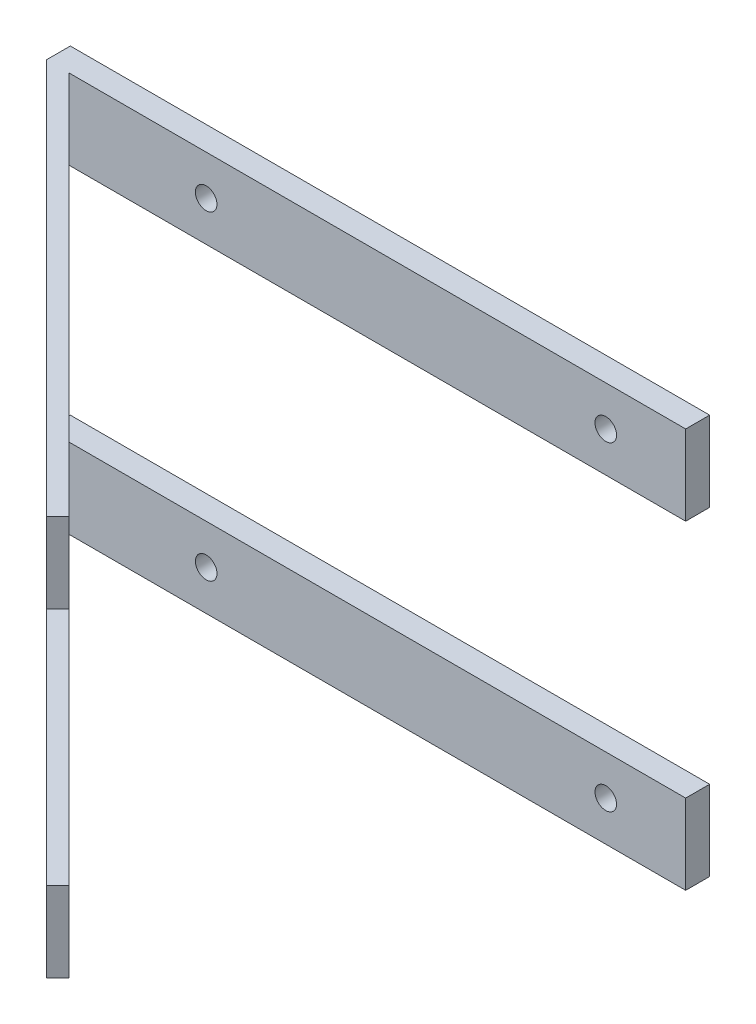
ISO-10303-21;
HEADER;
FILE_DESCRIPTION(('STEP AP214'),'2;1');
FILE_NAME('part.step','',(''),(''),'','','');
FILE_SCHEMA(('AUTOMOTIVE_DESIGN { 1 0 10303 214 1 1 1 1 }'));
ENDSEC;
DATA;
#1=APPLICATION_CONTEXT('core data for automotive mechanical design processes');
#2=APPLICATION_PROTOCOL_DEFINITION('international standard','automotive_design',2000,#1);
#3=PRODUCT_CONTEXT('',#1,'mechanical');
#4=PRODUCT('Part','Part','',(#3));
#5=PRODUCT_RELATED_PRODUCT_CATEGORY('part','',(#4));
#6=PRODUCT_DEFINITION_FORMATION('','',#4);
#7=PRODUCT_DEFINITION_CONTEXT('part definition',#1,'design');
#8=PRODUCT_DEFINITION('design','',#6,#7);
#9=PRODUCT_DEFINITION_SHAPE('','',#8);
#10=(LENGTH_UNIT() NAMED_UNIT(*) SI_UNIT(.MILLI.,.METRE.));
#11=(NAMED_UNIT(*) PLANE_ANGLE_UNIT() SI_UNIT($,.RADIAN.));
#12=(NAMED_UNIT(*) SI_UNIT($,.STERADIAN.) SOLID_ANGLE_UNIT());
#13=UNCERTAINTY_MEASURE_WITH_UNIT(LENGTH_MEASURE(1.E-05),#10,'distance_accuracy_value','');
#14=(GEOMETRIC_REPRESENTATION_CONTEXT(3) GLOBAL_UNCERTAINTY_ASSIGNED_CONTEXT((#13)) GLOBAL_UNIT_ASSIGNED_CONTEXT((#10,
#11,#12)) REPRESENTATION_CONTEXT('',''));
#15=CARTESIAN_POINT('',(0.,0.,0.));
#16=DIRECTION('',(0.,0.,1.));
#17=DIRECTION('',(1.,0.,0.));
#18=AXIS2_PLACEMENT_3D('',#15,#16,#17);
#19=CARTESIAN_POINT('',(0.,0.,3.));
#20=DIRECTION('',(0.,0.,1.));
#21=DIRECTION('',(1.,0.,0.));
#22=AXIS2_PLACEMENT_3D('',#19,#20,#21);
#23=PLANE('',#22);
#24=CARTESIAN_POINT('',(30.,4.99999999999999,3.));
#25=DIRECTION('',(0.,0.,1.));
#26=DIRECTION('',(1.,0.,0.));
#27=AXIS2_PLACEMENT_3D('',#24,#25,#26);
#28=CIRCLE('',#27,1.35);
#29=CARTESIAN_POINT('',(31.35,4.99999999999999,3.));
#30=VERTEX_POINT('',#29);
#31=EDGE_CURVE('E218',#30,#30,#28,.T.);
#32=ORIENTED_EDGE('',*,*,#31,.F.);
#33=EDGE_LOOP('',(#32));
#34=FACE_BOUND('',#33,.T.);
#35=CARTESIAN_POINT('',(-20.,4.99999999999999,3.));
#36=DIRECTION('',(0.,0.,1.));
#37=DIRECTION('',(1.,0.,0.));
#38=AXIS2_PLACEMENT_3D('',#35,#36,#37);
#39=CIRCLE('',#38,1.35);
#40=CARTESIAN_POINT('',(-18.65,4.99999999999999,3.));
#41=VERTEX_POINT('',#40);
#42=EDGE_CURVE('E174',#41,#41,#39,.T.);
#43=ORIENTED_EDGE('',*,*,#42,.F.);
#44=EDGE_LOOP('',(#43));
#45=FACE_BOUND('',#44,.T.);
#46=DIRECTION('',(1.,0.,0.));
#47=VECTOR('',#46,1.);
#48=CARTESIAN_POINT('',(-40.,10.,3.));
#49=LINE('',#48,#47);
#50=CARTESIAN_POINT('',(-37.1715728752538,9.99999999999999,3.));
#51=VERTEX_POINT('',#50);
#52=CARTESIAN_POINT('',(40.,10.,3.));
#53=VERTEX_POINT('',#52);
#54=EDGE_CURVE('E155',#51,#53,#49,.T.);
#55=ORIENTED_EDGE('',*,*,#54,.F.);
#56=DIRECTION('',(0.,-1.,0.));
#57=VECTOR('',#56,1.);
#58=CARTESIAN_POINT('',(-37.1715728752538,81.0070419043069,3.));
#59=LINE('',#58,#57);
#60=CARTESIAN_POINT('',(-37.1715728752538,0.,3.));
#61=VERTEX_POINT('',#60);
#62=EDGE_CURVE('E135',#51,#61,#59,.T.);
#63=ORIENTED_EDGE('',*,*,#62,.T.);
#64=DIRECTION('',(1.,0.,0.));
#65=VECTOR('',#64,1.);
#66=CARTESIAN_POINT('',(-40.,0.,3.));
#67=LINE('',#66,#65);
#68=CARTESIAN_POINT('',(40.,0.,3.));
#69=VERTEX_POINT('',#68);
#70=EDGE_CURVE('E87',#61,#69,#67,.T.);
#71=ORIENTED_EDGE('',*,*,#70,.T.);
#72=DIRECTION('',(0.,-1.,0.));
#73=VECTOR('',#72,1.);
#74=CARTESIAN_POINT('',(40.,10.,3.));
#75=LINE('',#74,#73);
#76=EDGE_CURVE('E165',#53,#69,#75,.T.);
#77=ORIENTED_EDGE('',*,*,#76,.F.);
#78=EDGE_LOOP('',(#55,#63,#71,#77));
#79=FACE_BOUND('',#78,.T.);
#80=ADVANCED_FACE('F47',(#34,#45,#79),#23,.T.);
#81=CARTESIAN_POINT('',(-40.,10.,3.));
#82=DIRECTION('',(1.,0.,0.));
#83=DIRECTION('',(0.,0.,-1.));
#84=AXIS2_PLACEMENT_3D('',#81,#82,#83);
#85=PLANE('',#84);
#86=DIRECTION('',(0.,-1.,0.));
#87=VECTOR('',#86,1.);
#88=CARTESIAN_POINT('',(-40.,10.,0.));
#89=LINE('',#88,#87);
#90=CARTESIAN_POINT('',(-40.,10.,0.));
#91=VERTEX_POINT('',#90);
#92=CARTESIAN_POINT('',(-40.,0.,0.));
#93=VERTEX_POINT('',#92);
#94=EDGE_CURVE('E12',#91,#93,#89,.T.);
#95=ORIENTED_EDGE('',*,*,#94,.T.);
#96=DIRECTION('',(0.,0.,-1.));
#97=VECTOR('',#96,1.);
#98=CARTESIAN_POINT('',(-40.,0.,3.));
#99=LINE('',#98,#97);
#100=CARTESIAN_POINT('',(-40.,0.,3.));
#101=VERTEX_POINT('',#100);
#102=EDGE_CURVE('E143',#101,#93,#99,.T.);
#103=ORIENTED_EDGE('',*,*,#102,.F.);
#104=DIRECTION('',(0.,-1.,0.));
#105=VECTOR('',#104,1.);
#106=CARTESIAN_POINT('',(-40.,10.,3.));
#107=LINE('',#106,#105);
#108=CARTESIAN_POINT('',(-40.,9.99999999999999,3.));
#109=VERTEX_POINT('',#108);
#110=EDGE_CURVE('E160',#109,#101,#107,.T.);
#111=ORIENTED_EDGE('',*,*,#110,.F.);
#112=DIRECTION('',(0.,0.,-1.));
#113=VECTOR('',#112,1.);
#114=CARTESIAN_POINT('',(-40.,10.,3.));
#115=LINE('',#114,#113);
#116=EDGE_CURVE('E94',#109,#91,#115,.T.);
#117=ORIENTED_EDGE('',*,*,#116,.T.);
#118=EDGE_LOOP('',(#95,#103,#111,#117));
#119=FACE_BOUND('',#118,.T.);
#120=ADVANCED_FACE('F195',(#119),#85,.F.);
#121=CARTESIAN_POINT('',(-40.,0.,3.));
#122=DIRECTION('',(0.,1.,0.));
#123=DIRECTION('',(0.,0.,1.));
#124=AXIS2_PLACEMENT_3D('',#121,#122,#123);
#125=PLANE('',#124);
#126=DIRECTION('',(1.,0.,0.));
#127=VECTOR('',#126,1.);
#128=CARTESIAN_POINT('',(-40.,0.,0.));
#129=LINE('',#128,#127);
#130=CARTESIAN_POINT('',(40.,0.,0.));
#131=VERTEX_POINT('',#130);
#132=EDGE_CURVE('E55',#93,#131,#129,.T.);
#133=ORIENTED_EDGE('',*,*,#132,.T.);
#134=DIRECTION('',(0.,0.,-1.));
#135=VECTOR('',#134,1.);
#136=CARTESIAN_POINT('',(40.,0.,3.));
#137=LINE('',#136,#135);
#138=EDGE_CURVE('E150',#69,#131,#137,.T.);
#139=ORIENTED_EDGE('',*,*,#138,.F.);
#140=ORIENTED_EDGE('',*,*,#70,.F.);
#141=DIRECTION('',(0.707106781186551,0.,0.707106781186544));
#142=VECTOR('',#141,1.);
#143=CARTESIAN_POINT('',(10.9116882454317,0.,51.083261120685));
#144=LINE('',#143,#142);
#145=CARTESIAN_POINT('',(10.9116882454317,0.,51.083261120685));
#146=VERTEX_POINT('',#145);
#147=EDGE_CURVE('E63',#61,#146,#144,.T.);
#148=ORIENTED_EDGE('',*,*,#147,.T.);
#149=DIRECTION('',(-0.707106781186542,0.,0.707106781186553));
#150=VECTOR('',#149,1.);
#151=CARTESIAN_POINT('',(9.49747468305858,0.,52.4974746830581));
#152=LINE('',#151,#150);
#153=CARTESIAN_POINT('',(9.49747468305858,0.,52.4974746830581));
#154=VERTEX_POINT('',#153);
#155=EDGE_CURVE('E132',#146,#154,#152,.T.);
#156=ORIENTED_EDGE('',*,*,#155,.T.);
#157=DIRECTION('',(-0.707106781186551,0.,-0.707106781186544));
#158=VECTOR('',#157,1.);
#159=CARTESIAN_POINT('',(-40.,0.,3.));
#160=LINE('',#159,#158);
#161=EDGE_CURVE('E137',#154,#101,#160,.T.);
#162=ORIENTED_EDGE('',*,*,#161,.T.);
#163=ORIENTED_EDGE('',*,*,#102,.T.);
#164=EDGE_LOOP('',(#133,#139,#140,#148,#156,#162,#163));
#165=FACE_BOUND('',#164,.T.);
#166=ADVANCED_FACE('F185',(#165),#125,.F.);
#167=CARTESIAN_POINT('',(40.,10.,3.));
#168=DIRECTION('',(1.,0.,0.));
#169=DIRECTION('',(0.,0.,-1.));
#170=AXIS2_PLACEMENT_3D('',#167,#168,#169);
#171=PLANE('',#170);
#172=DIRECTION('',(0.,-1.,0.));
#173=VECTOR('',#172,1.);
#174=CARTESIAN_POINT('',(40.,10.,0.));
#175=LINE('',#174,#173);
#176=CARTESIAN_POINT('',(40.,10.,0.));
#177=VERTEX_POINT('',#176);
#178=EDGE_CURVE('E159',#177,#131,#175,.T.);
#179=ORIENTED_EDGE('',*,*,#178,.F.);
#180=DIRECTION('',(0.,0.,-1.));
#181=VECTOR('',#180,1.);
#182=CARTESIAN_POINT('',(40.,10.,3.));
#183=LINE('',#182,#181);
#184=EDGE_CURVE('E152',#53,#177,#183,.T.);
#185=ORIENTED_EDGE('',*,*,#184,.F.);
#186=ORIENTED_EDGE('',*,*,#76,.T.);
#187=ORIENTED_EDGE('',*,*,#138,.T.);
#188=EDGE_LOOP('',(#179,#185,#186,#187));
#189=FACE_BOUND('',#188,.T.);
#190=ADVANCED_FACE('F193',(#189),#171,.T.);
#191=CARTESIAN_POINT('',(-40.,10.,3.));
#192=DIRECTION('',(0.,1.,0.));
#193=DIRECTION('',(0.,0.,1.));
#194=AXIS2_PLACEMENT_3D('',#191,#192,#193);
#195=PLANE('',#194);
#196=DIRECTION('',(1.,0.,0.));
#197=VECTOR('',#196,1.);
#198=CARTESIAN_POINT('',(-40.,10.,0.));
#199=LINE('',#198,#197);
#200=EDGE_CURVE('E156',#91,#177,#199,.T.);
#201=ORIENTED_EDGE('',*,*,#200,.F.);
#202=ORIENTED_EDGE('',*,*,#116,.F.);
#203=DIRECTION('',(-0.707106781186551,0.,-0.707106781186544));
#204=VECTOR('',#203,1.);
#205=CARTESIAN_POINT('',(-40.,9.99999999999999,3.));
#206=LINE('',#205,#204);
#207=CARTESIAN_POINT('',(9.49747468305858,9.99999999999999,52.4974746830581));
#208=VERTEX_POINT('',#207);
#209=EDGE_CURVE('E123',#208,#109,#206,.T.);
#210=ORIENTED_EDGE('',*,*,#209,.F.);
#211=DIRECTION('',(-0.707106781186542,0.,0.707106781186553));
#212=VECTOR('',#211,1.);
#213=CARTESIAN_POINT('',(9.49747468305858,9.99999999999999,52.4974746830581));
#214=LINE('',#213,#212);
#215=CARTESIAN_POINT('',(10.9116882454317,9.99999999999999,51.083261120685));
#216=VERTEX_POINT('',#215);
#217=EDGE_CURVE('E117',#216,#208,#214,.T.);
#218=ORIENTED_EDGE('',*,*,#217,.F.);
#219=DIRECTION('',(0.707106781186551,0.,0.707106781186544));
#220=VECTOR('',#219,1.);
#221=CARTESIAN_POINT('',(10.9116882454317,9.99999999999999,51.083261120685));
#222=LINE('',#221,#220);
#223=EDGE_CURVE('E122',#51,#216,#222,.T.);
#224=ORIENTED_EDGE('',*,*,#223,.F.);
#225=ORIENTED_EDGE('',*,*,#54,.T.);
#226=ORIENTED_EDGE('',*,*,#184,.T.);
#227=EDGE_LOOP('',(#201,#202,#210,#218,#224,#225,#226));
#228=FACE_BOUND('',#227,.T.);
#229=ADVANCED_FACE('F120',(#228),#195,.T.);
#230=CARTESIAN_POINT('',(0.,0.,0.));
#231=DIRECTION('',(0.,0.,1.));
#232=DIRECTION('',(1.,0.,0.));
#233=AXIS2_PLACEMENT_3D('',#230,#231,#232);
#234=PLANE('',#233);
#235=CARTESIAN_POINT('',(30.,4.99999999999999,0.));
#236=DIRECTION('',(0.,0.,1.));
#237=DIRECTION('',(1.,0.,0.));
#238=AXIS2_PLACEMENT_3D('',#235,#236,#237);
#239=CIRCLE('',#238,1.35);
#240=CARTESIAN_POINT('',(31.35,4.99999999999999,0.));
#241=VERTEX_POINT('',#240);
#242=EDGE_CURVE('E179',#241,#241,#239,.T.);
#243=ORIENTED_EDGE('',*,*,#242,.T.);
#244=EDGE_LOOP('',(#243));
#245=FACE_BOUND('',#244,.T.);
#246=CARTESIAN_POINT('',(-20.,4.99999999999999,0.));
#247=DIRECTION('',(0.,0.,1.));
#248=DIRECTION('',(1.,0.,0.));
#249=AXIS2_PLACEMENT_3D('',#246,#247,#248);
#250=CIRCLE('',#249,1.35);
#251=CARTESIAN_POINT('',(-18.65,4.99999999999999,0.));
#252=VERTEX_POINT('',#251);
#253=EDGE_CURVE('E170',#252,#252,#250,.T.);
#254=ORIENTED_EDGE('',*,*,#253,.T.);
#255=EDGE_LOOP('',(#254));
#256=FACE_BOUND('',#255,.T.);
#257=ORIENTED_EDGE('',*,*,#94,.F.);
#258=ORIENTED_EDGE('',*,*,#200,.T.);
#259=ORIENTED_EDGE('',*,*,#178,.T.);
#260=ORIENTED_EDGE('',*,*,#132,.F.);
#261=EDGE_LOOP('',(#257,#258,#259,#260));
#262=FACE_BOUND('',#261,.T.);
#263=ADVANCED_FACE('F194',(#245,#256,#262),#234,.F.);
#264=CARTESIAN_POINT('',(10.9116882454317,81.0070419043069,51.083261120685));
#265=DIRECTION('',(0.707106781186544,0.,-0.707106781186551));
#266=DIRECTION('',(-0.707106781186551,0.,-0.707106781186544));
#267=AXIS2_PLACEMENT_3D('',#264,#265,#266);
#268=PLANE('',#267);
#269=ORIENTED_EDGE('',*,*,#62,.F.);
#270=ORIENTED_EDGE('',*,*,#223,.T.);
#271=DIRECTION('',(0.,-1.,0.));
#272=VECTOR('',#271,1.);
#273=CARTESIAN_POINT('',(10.9116882454317,81.0070419043069,51.083261120685));
#274=LINE('',#273,#272);
#275=EDGE_CURVE('E127',#216,#146,#274,.T.);
#276=ORIENTED_EDGE('',*,*,#275,.T.);
#277=ORIENTED_EDGE('',*,*,#147,.F.);
#278=EDGE_LOOP('',(#269,#270,#276,#277));
#279=FACE_BOUND('',#278,.T.);
#280=ADVANCED_FACE('F134',(#279),#268,.T.);
#281=CARTESIAN_POINT('',(9.49747468305858,81.0070419043069,52.4974746830581));
#282=DIRECTION('',(0.707106781186553,0.,0.707106781186542));
#283=DIRECTION('',(0.707106781186542,0.,-0.707106781186553));
#284=AXIS2_PLACEMENT_3D('',#281,#282,#283);
#285=PLANE('',#284);
#286=ORIENTED_EDGE('',*,*,#275,.F.);
#287=ORIENTED_EDGE('',*,*,#217,.T.);
#288=DIRECTION('',(0.,-1.,0.));
#289=VECTOR('',#288,1.);
#290=CARTESIAN_POINT('',(9.49747468305858,81.0070419043069,52.4974746830581));
#291=LINE('',#290,#289);
#292=EDGE_CURVE('E126',#208,#154,#291,.T.);
#293=ORIENTED_EDGE('',*,*,#292,.T.);
#294=ORIENTED_EDGE('',*,*,#155,.F.);
#295=EDGE_LOOP('',(#286,#287,#293,#294));
#296=FACE_BOUND('',#295,.T.);
#297=ADVANCED_FACE('F130',(#296),#285,.T.);
#298=CARTESIAN_POINT('',(-40.,81.0070419043069,3.));
#299=DIRECTION('',(-0.707106781186544,0.,0.707106781186551));
#300=DIRECTION('',(0.707106781186551,0.,0.707106781186544));
#301=AXIS2_PLACEMENT_3D('',#298,#299,#300);
#302=PLANE('',#301);
#303=ORIENTED_EDGE('',*,*,#292,.F.);
#304=ORIENTED_EDGE('',*,*,#209,.T.);
#305=ORIENTED_EDGE('',*,*,#110,.T.);
#306=ORIENTED_EDGE('',*,*,#161,.F.);
#307=EDGE_LOOP('',(#303,#304,#305,#306));
#308=FACE_BOUND('',#307,.T.);
#309=ADVANCED_FACE('F187',(#308),#302,.T.);
#310=CARTESIAN_POINT('',(-20.,4.99999999999999,3.));
#311=DIRECTION('',(0.,0.,1.));
#312=DIRECTION('',(1.,0.,0.));
#313=AXIS2_PLACEMENT_3D('',#310,#311,#312);
#314=CYLINDRICAL_SURFACE('',#313,1.35);
#315=ORIENTED_EDGE('',*,*,#253,.F.);
#316=EDGE_LOOP('',(#315));
#317=FACE_BOUND('',#316,.T.);
#318=ORIENTED_EDGE('',*,*,#42,.T.);
#319=EDGE_LOOP('',(#318));
#320=FACE_BOUND('',#319,.T.);
#321=ADVANCED_FACE('F227',(#317,#320),#314,.F.);
#322=CARTESIAN_POINT('',(30.,4.99999999999999,3.));
#323=DIRECTION('',(0.,0.,1.));
#324=DIRECTION('',(1.,0.,0.));
#325=AXIS2_PLACEMENT_3D('',#322,#323,#324);
#326=CYLINDRICAL_SURFACE('',#325,1.35);
#327=ORIENTED_EDGE('',*,*,#242,.F.);
#328=EDGE_LOOP('',(#327));
#329=FACE_BOUND('',#328,.T.);
#330=ORIENTED_EDGE('',*,*,#31,.T.);
#331=EDGE_LOOP('',(#330));
#332=FACE_BOUND('',#331,.T.);
#333=ADVANCED_FACE('F223',(#329,#332),#326,.F.);
#334=CLOSED_SHELL('',(#80,#120,#166,#190,#229,#263,#280,#297,#309,#321,#333));
#335=MANIFOLD_SOLID_BREP('B2',#334);
#336=CARTESIAN_POINT('',(-40.,0.,3.));
#337=DIRECTION('',(-1.,0.,0.));
#338=DIRECTION('',(0.,0.,1.));
#339=AXIS2_PLACEMENT_3D('',#336,#337,#338);
#340=PLANE('',#339);
#341=DIRECTION('',(0.,1.,0.));
#342=VECTOR('',#341,1.);
#343=CARTESIAN_POINT('',(-40.,0.,0.));
#344=LINE('',#343,#342);
#345=CARTESIAN_POINT('',(-40.,40.,0.));
#346=VERTEX_POINT('',#345);
#347=CARTESIAN_POINT('',(-40.,50.,0.));
#348=VERTEX_POINT('',#347);
#349=EDGE_CURVE('E412',#346,#348,#344,.T.);
#350=ORIENTED_EDGE('',*,*,#349,.F.);
#351=DIRECTION('',(0.,0.,-1.));
#352=VECTOR('',#351,1.);
#353=CARTESIAN_POINT('',(-40.,40.,3.));
#354=LINE('',#353,#352);
#355=CARTESIAN_POINT('',(-40.,40.,3.));
#356=VERTEX_POINT('',#355);
#357=EDGE_CURVE('E45',#356,#346,#354,.T.);
#358=ORIENTED_EDGE('',*,*,#357,.F.);
#359=DIRECTION('',(0.,1.,0.));
#360=VECTOR('',#359,1.);
#361=CARTESIAN_POINT('',(-40.,0.,3.));
#362=LINE('',#361,#360);
#363=CARTESIAN_POINT('',(-40.,50.,3.));
#364=VERTEX_POINT('',#363);
#365=EDGE_CURVE('E438',#356,#364,#362,.T.);
#366=ORIENTED_EDGE('',*,*,#365,.T.);
#367=DIRECTION('',(0.,0.,-1.));
#368=VECTOR('',#367,1.);
#369=CARTESIAN_POINT('',(-40.,50.,3.));
#370=LINE('',#369,#368);
#371=EDGE_CURVE('E332',#364,#348,#370,.T.);
#372=ORIENTED_EDGE('',*,*,#371,.T.);
#373=EDGE_LOOP('',(#350,#358,#366,#372));
#374=FACE_BOUND('',#373,.T.);
#375=ADVANCED_FACE('F307',(#374),#340,.T.);
#376=CARTESIAN_POINT('',(0.,40.,3.));
#377=DIRECTION('',(0.,1.,0.));
#378=DIRECTION('',(0.,0.,1.));
#379=AXIS2_PLACEMENT_3D('',#376,#377,#378);
#380=PLANE('',#379);
#381=DIRECTION('',(1.,0.,0.));
#382=VECTOR('',#381,1.);
#383=CARTESIAN_POINT('',(0.,40.,0.));
#384=LINE('',#383,#382);
#385=CARTESIAN_POINT('',(40.,40.,0.));
#386=VERTEX_POINT('',#385);
#387=EDGE_CURVE('E444',#346,#386,#384,.T.);
#388=ORIENTED_EDGE('',*,*,#387,.T.);
#389=DIRECTION('',(0.,0.,-1.));
#390=VECTOR('',#389,1.);
#391=CARTESIAN_POINT('',(40.,40.,3.));
#392=LINE('',#391,#390);
#393=CARTESIAN_POINT('',(40.,40.,3.));
#394=VERTEX_POINT('',#393);
#395=EDGE_CURVE('E315',#394,#386,#392,.T.);
#396=ORIENTED_EDGE('',*,*,#395,.F.);
#397=DIRECTION('',(1.,0.,0.));
#398=VECTOR('',#397,1.);
#399=CARTESIAN_POINT('',(0.,40.,3.));
#400=LINE('',#399,#398);
#401=CARTESIAN_POINT('',(-37.1715728752538,40.,3.));
#402=VERTEX_POINT('',#401);
#403=EDGE_CURVE('E424',#402,#394,#400,.T.);
#404=ORIENTED_EDGE('',*,*,#403,.F.);
#405=DIRECTION('',(0.707106781186551,0.,0.707106781186544));
#406=VECTOR('',#405,1.);
#407=CARTESIAN_POINT('',(10.9116882454317,40.,51.083261120685));
#408=LINE('',#407,#406);
#409=CARTESIAN_POINT('',(10.9116882454317,40.,51.083261120685));
#410=VERTEX_POINT('',#409);
#411=EDGE_CURVE('E409',#402,#410,#408,.T.);
#412=ORIENTED_EDGE('',*,*,#411,.T.);
#413=DIRECTION('',(-0.707106781186545,0.,0.707106781186551));
#414=VECTOR('',#413,1.);
#415=CARTESIAN_POINT('',(9.49747468305859,40.,52.4974746830581));
#416=LINE('',#415,#414);
#417=CARTESIAN_POINT('',(9.49747468305859,40.,52.4974746830581));
#418=VERTEX_POINT('',#417);
#419=EDGE_CURVE('E397',#410,#418,#416,.T.);
#420=ORIENTED_EDGE('',*,*,#419,.T.);
#421=DIRECTION('',(-0.707106781186551,0.,-0.707106781186544));
#422=VECTOR('',#421,1.);
#423=CARTESIAN_POINT('',(-40.,40.,3.));
#424=LINE('',#423,#422);
#425=EDGE_CURVE('E377',#418,#356,#424,.T.);
#426=ORIENTED_EDGE('',*,*,#425,.T.);
#427=ORIENTED_EDGE('',*,*,#357,.T.);
#428=EDGE_LOOP('',(#388,#396,#404,#412,#420,#426,#427));
#429=FACE_BOUND('',#428,.T.);
#430=ADVANCED_FACE('F414',(#429),#380,.F.);
#431=CARTESIAN_POINT('',(40.,0.,3.));
#432=DIRECTION('',(-1.,0.,0.));
#433=DIRECTION('',(0.,0.,1.));
#434=AXIS2_PLACEMENT_3D('',#431,#432,#433);
#435=PLANE('',#434);
#436=DIRECTION('',(0.,1.,0.));
#437=VECTOR('',#436,1.);
#438=CARTESIAN_POINT('',(40.,0.,0.));
#439=LINE('',#438,#437);
#440=CARTESIAN_POINT('',(40.,50.,0.));
#441=VERTEX_POINT('',#440);
#442=EDGE_CURVE('E431',#386,#441,#439,.T.);
#443=ORIENTED_EDGE('',*,*,#442,.T.);
#444=DIRECTION('',(0.,0.,-1.));
#445=VECTOR('',#444,1.);
#446=CARTESIAN_POINT('',(40.,50.,3.));
#447=LINE('',#446,#445);
#448=CARTESIAN_POINT('',(40.,50.,3.));
#449=VERTEX_POINT('',#448);
#450=EDGE_CURVE('E419',#449,#441,#447,.T.);
#451=ORIENTED_EDGE('',*,*,#450,.F.);
#452=DIRECTION('',(0.,1.,0.));
#453=VECTOR('',#452,1.);
#454=CARTESIAN_POINT('',(40.,0.,3.));
#455=LINE('',#454,#453);
#456=EDGE_CURVE('E421',#394,#449,#455,.T.);
#457=ORIENTED_EDGE('',*,*,#456,.F.);
#458=ORIENTED_EDGE('',*,*,#395,.T.);
#459=EDGE_LOOP('',(#443,#451,#457,#458));
#460=FACE_BOUND('',#459,.T.);
#461=ADVANCED_FACE('F429',(#460),#435,.F.);
#462=CARTESIAN_POINT('',(0.,50.,3.));
#463=DIRECTION('',(0.,1.,0.));
#464=DIRECTION('',(0.,0.,1.));
#465=AXIS2_PLACEMENT_3D('',#462,#463,#464);
#466=PLANE('',#465);
#467=DIRECTION('',(1.,0.,0.));
#468=VECTOR('',#467,1.);
#469=CARTESIAN_POINT('',(0.,50.,0.));
#470=LINE('',#469,#468);
#471=EDGE_CURVE('E446',#348,#441,#470,.T.);
#472=ORIENTED_EDGE('',*,*,#471,.F.);
#473=ORIENTED_EDGE('',*,*,#371,.F.);
#474=DIRECTION('',(0.707106781186551,0.,0.707106781186544));
#475=VECTOR('',#474,1.);
#476=CARTESIAN_POINT('',(-40.,50.,3.));
#477=LINE('',#476,#475);
#478=CARTESIAN_POINT('',(9.49747468305859,50.,52.4974746830581));
#479=VERTEX_POINT('',#478);
#480=EDGE_CURVE('E376',#364,#479,#477,.T.);
#481=ORIENTED_EDGE('',*,*,#480,.T.);
#482=DIRECTION('',(0.707106781186544,0.,-0.70710678118655));
#483=VECTOR('',#482,1.);
#484=CARTESIAN_POINT('',(9.49747468305859,50.,52.4974746830581));
#485=LINE('',#484,#483);
#486=CARTESIAN_POINT('',(10.9116882454317,50.,51.083261120685));
#487=VERTEX_POINT('',#486);
#488=EDGE_CURVE('E384',#479,#487,#485,.T.);
#489=ORIENTED_EDGE('',*,*,#488,.T.);
#490=DIRECTION('',(-0.707106781186551,0.,-0.707106781186544));
#491=VECTOR('',#490,1.);
#492=CARTESIAN_POINT('',(10.9116882454317,50.,51.083261120685));
#493=LINE('',#492,#491);
#494=CARTESIAN_POINT('',(-37.1715728752538,50.,3.));
#495=VERTEX_POINT('',#494);
#496=EDGE_CURVE('E381',#487,#495,#493,.T.);
#497=ORIENTED_EDGE('',*,*,#496,.T.);
#498=DIRECTION('',(1.,0.,0.));
#499=VECTOR('',#498,1.);
#500=CARTESIAN_POINT('',(0.,50.,3.));
#501=LINE('',#500,#499);
#502=EDGE_CURVE('E404',#495,#449,#501,.T.);
#503=ORIENTED_EDGE('',*,*,#502,.T.);
#504=ORIENTED_EDGE('',*,*,#450,.T.);
#505=EDGE_LOOP('',(#472,#473,#481,#489,#497,#503,#504));
#506=FACE_BOUND('',#505,.T.);
#507=ADVANCED_FACE('F390',(#506),#466,.T.);
#508=CARTESIAN_POINT('',(0.,0.,3.));
#509=DIRECTION('',(0.,0.,1.));
#510=DIRECTION('',(1.,0.,0.));
#511=AXIS2_PLACEMENT_3D('',#508,#509,#510);
#512=PLANE('',#511);
#513=CARTESIAN_POINT('',(-20.,45.,3.));
#514=DIRECTION('',(0.,0.,1.));
#515=DIRECTION('',(1.,0.,0.));
#516=AXIS2_PLACEMENT_3D('',#513,#514,#515);
#517=CIRCLE('',#516,1.35);
#518=CARTESIAN_POINT('',(-18.65,45.,3.));
#519=VERTEX_POINT('',#518);
#520=EDGE_CURVE('E487',#519,#519,#517,.T.);
#521=ORIENTED_EDGE('',*,*,#520,.F.);
#522=EDGE_LOOP('',(#521));
#523=FACE_BOUND('',#522,.T.);
#524=CARTESIAN_POINT('',(30.,45.,3.));
#525=DIRECTION('',(0.,0.,1.));
#526=DIRECTION('',(1.,0.,0.));
#527=AXIS2_PLACEMENT_3D('',#524,#525,#526);
#528=CIRCLE('',#527,1.35);
#529=CARTESIAN_POINT('',(31.35,45.,3.));
#530=VERTEX_POINT('',#529);
#531=EDGE_CURVE('E394',#530,#530,#528,.T.);
#532=ORIENTED_EDGE('',*,*,#531,.F.);
#533=EDGE_LOOP('',(#532));
#534=FACE_BOUND('',#533,.T.);
#535=DIRECTION('',(0.,1.,0.));
#536=VECTOR('',#535,1.);
#537=CARTESIAN_POINT('',(-37.1715728752538,-31.0070419043069,3.));
#538=LINE('',#537,#536);
#539=EDGE_CURVE('E323',#402,#495,#538,.T.);
#540=ORIENTED_EDGE('',*,*,#539,.F.);
#541=ORIENTED_EDGE('',*,*,#403,.T.);
#542=ORIENTED_EDGE('',*,*,#456,.T.);
#543=ORIENTED_EDGE('',*,*,#502,.F.);
#544=EDGE_LOOP('',(#540,#541,#542,#543));
#545=FACE_BOUND('',#544,.T.);
#546=ADVANCED_FACE('F423',(#523,#534,#545),#512,.T.);
#547=CARTESIAN_POINT('',(0.,0.,0.));
#548=DIRECTION('',(0.,0.,1.));
#549=DIRECTION('',(1.,0.,0.));
#550=AXIS2_PLACEMENT_3D('',#547,#548,#549);
#551=PLANE('',#550);
#552=CARTESIAN_POINT('',(-20.,45.,0.));
#553=DIRECTION('',(0.,0.,1.));
#554=DIRECTION('',(1.,0.,0.));
#555=AXIS2_PLACEMENT_3D('',#552,#553,#554);
#556=CIRCLE('',#555,1.35);
#557=CARTESIAN_POINT('',(-18.65,45.,0.));
#558=VERTEX_POINT('',#557);
#559=EDGE_CURVE('E484',#558,#558,#556,.T.);
#560=ORIENTED_EDGE('',*,*,#559,.T.);
#561=EDGE_LOOP('',(#560));
#562=FACE_BOUND('',#561,.T.);
#563=CARTESIAN_POINT('',(30.,45.,0.));
#564=DIRECTION('',(0.,0.,1.));
#565=DIRECTION('',(1.,0.,0.));
#566=AXIS2_PLACEMENT_3D('',#563,#564,#565);
#567=CIRCLE('',#566,1.35);
#568=CARTESIAN_POINT('',(31.35,45.,0.));
#569=VERTEX_POINT('',#568);
#570=EDGE_CURVE('E391',#569,#569,#567,.T.);
#571=ORIENTED_EDGE('',*,*,#570,.T.);
#572=EDGE_LOOP('',(#571));
#573=FACE_BOUND('',#572,.T.);
#574=ORIENTED_EDGE('',*,*,#349,.T.);
#575=ORIENTED_EDGE('',*,*,#471,.T.);
#576=ORIENTED_EDGE('',*,*,#442,.F.);
#577=ORIENTED_EDGE('',*,*,#387,.F.);
#578=EDGE_LOOP('',(#574,#575,#576,#577));
#579=FACE_BOUND('',#578,.T.);
#580=ADVANCED_FACE('F459',(#562,#573,#579),#551,.F.);
#581=CARTESIAN_POINT('',(10.9116882454317,-31.0070419043069,51.083261120685));
#582=DIRECTION('',(0.707106781186544,0.,-0.707106781186551));
#583=DIRECTION('',(-0.707106781186551,0.,-0.707106781186544));
#584=AXIS2_PLACEMENT_3D('',#581,#582,#583);
#585=PLANE('',#584);
#586=ORIENTED_EDGE('',*,*,#411,.F.);
#587=ORIENTED_EDGE('',*,*,#539,.T.);
#588=ORIENTED_EDGE('',*,*,#496,.F.);
#589=DIRECTION('',(0.,1.,0.));
#590=VECTOR('',#589,1.);
#591=CARTESIAN_POINT('',(10.9116882454317,-31.0070419043069,51.083261120685));
#592=LINE('',#591,#590);
#593=EDGE_CURVE('E380',#410,#487,#592,.T.);
#594=ORIENTED_EDGE('',*,*,#593,.F.);
#595=EDGE_LOOP('',(#586,#587,#588,#594));
#596=FACE_BOUND('',#595,.T.);
#597=ADVANCED_FACE('F416',(#596),#585,.T.);
#598=CARTESIAN_POINT('',(9.49747468305859,-31.0070419043069,52.4974746830581));
#599=DIRECTION('',(0.707106781186551,0.,0.707106781186545));
#600=DIRECTION('',(0.707106781186545,0.,-0.707106781186551));
#601=AXIS2_PLACEMENT_3D('',#598,#599,#600);
#602=PLANE('',#601);
#603=ORIENTED_EDGE('',*,*,#419,.F.);
#604=ORIENTED_EDGE('',*,*,#593,.T.);
#605=ORIENTED_EDGE('',*,*,#488,.F.);
#606=DIRECTION('',(0.,1.,0.));
#607=VECTOR('',#606,1.);
#608=CARTESIAN_POINT('',(9.49747468305859,-31.0070419043069,52.4974746830581));
#609=LINE('',#608,#607);
#610=EDGE_CURVE('E372',#418,#479,#609,.T.);
#611=ORIENTED_EDGE('',*,*,#610,.F.);
#612=EDGE_LOOP('',(#603,#604,#605,#611));
#613=FACE_BOUND('',#612,.T.);
#614=ADVANCED_FACE('F385',(#613),#602,.T.);
#615=CARTESIAN_POINT('',(-40.,-31.0070419043069,3.));
#616=DIRECTION('',(-0.707106781186544,0.,0.707106781186551));
#617=DIRECTION('',(0.707106781186551,0.,0.707106781186544));
#618=AXIS2_PLACEMENT_3D('',#615,#616,#617);
#619=PLANE('',#618);
#620=ORIENTED_EDGE('',*,*,#425,.F.);
#621=ORIENTED_EDGE('',*,*,#610,.T.);
#622=ORIENTED_EDGE('',*,*,#480,.F.);
#623=ORIENTED_EDGE('',*,*,#365,.F.);
#624=EDGE_LOOP('',(#620,#621,#622,#623));
#625=FACE_BOUND('',#624,.T.);
#626=ADVANCED_FACE('F374',(#625),#619,.T.);
#627=CARTESIAN_POINT('',(30.,45.,3.));
#628=DIRECTION('',(0.,0.,1.));
#629=DIRECTION('',(1.,0.,0.));
#630=AXIS2_PLACEMENT_3D('',#627,#628,#629);
#631=CYLINDRICAL_SURFACE('',#630,1.35);
#632=ORIENTED_EDGE('',*,*,#570,.F.);
#633=EDGE_LOOP('',(#632));
#634=FACE_BOUND('',#633,.T.);
#635=ORIENTED_EDGE('',*,*,#531,.T.);
#636=EDGE_LOOP('',(#635));
#637=FACE_BOUND('',#636,.T.);
#638=ADVANCED_FACE('F468',(#634,#637),#631,.F.);
#639=CARTESIAN_POINT('',(-20.,45.,3.));
#640=DIRECTION('',(0.,0.,1.));
#641=DIRECTION('',(1.,0.,0.));
#642=AXIS2_PLACEMENT_3D('',#639,#640,#641);
#643=CYLINDRICAL_SURFACE('',#642,1.35);
#644=ORIENTED_EDGE('',*,*,#559,.F.);
#645=EDGE_LOOP('',(#644));
#646=FACE_BOUND('',#645,.T.);
#647=ORIENTED_EDGE('',*,*,#520,.T.);
#648=EDGE_LOOP('',(#647));
#649=FACE_BOUND('',#648,.T.);
#650=ADVANCED_FACE('F475',(#646,#649),#643,.F.);
#651=CLOSED_SHELL('',(#375,#430,#461,#507,#546,#580,#597,#614,#626,#638,#650));
#652=MANIFOLD_SOLID_BREP('B6',#651);
#653=ADVANCED_BREP_SHAPE_REPRESENTATION('',(#18,#335,#652),#14);
#654=SHAPE_DEFINITION_REPRESENTATION(#9,#653);
ENDSEC;
END-ISO-10303-21;
